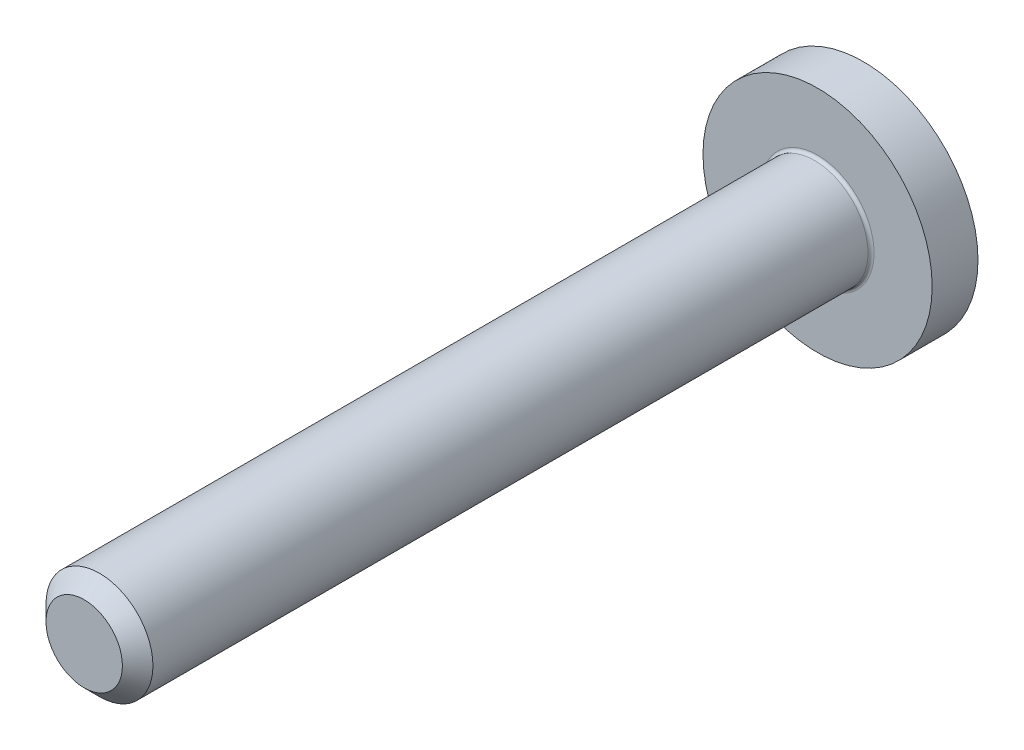
ISO-10303-21;
HEADER;
FILE_DESCRIPTION(('STEP AP214'),'2;1');
FILE_NAME('part.step','',(''),(''),'','','');
FILE_SCHEMA(('AUTOMOTIVE_DESIGN { 1 0 10303 214 1 1 1 1 }'));
ENDSEC;
DATA;
#1=APPLICATION_CONTEXT('core data for automotive mechanical design processes');
#2=APPLICATION_PROTOCOL_DEFINITION('international standard','automotive_design',2000,#1);
#3=PRODUCT_CONTEXT('',#1,'mechanical');
#4=PRODUCT('Part','Part','',(#3));
#5=PRODUCT_RELATED_PRODUCT_CATEGORY('part','',(#4));
#6=PRODUCT_DEFINITION_FORMATION('','',#4);
#7=PRODUCT_DEFINITION_CONTEXT('part definition',#1,'design');
#8=PRODUCT_DEFINITION('design','',#6,#7);
#9=PRODUCT_DEFINITION_SHAPE('','',#8);
#10=(LENGTH_UNIT() NAMED_UNIT(*) SI_UNIT(.MILLI.,.METRE.));
#11=(NAMED_UNIT(*) PLANE_ANGLE_UNIT() SI_UNIT($,.RADIAN.));
#12=(NAMED_UNIT(*) SI_UNIT($,.STERADIAN.) SOLID_ANGLE_UNIT());
#13=UNCERTAINTY_MEASURE_WITH_UNIT(LENGTH_MEASURE(1.E-05),#10,'distance_accuracy_value','');
#14=(GEOMETRIC_REPRESENTATION_CONTEXT(3) GLOBAL_UNCERTAINTY_ASSIGNED_CONTEXT((#13)) GLOBAL_UNIT_ASSIGNED_CONTEXT((#10,
#11,#12)) REPRESENTATION_CONTEXT('',''));
#15=CARTESIAN_POINT('',(0.,0.,0.));
#16=DIRECTION('',(0.,0.,1.));
#17=DIRECTION('',(1.,0.,0.));
#18=AXIS2_PLACEMENT_3D('',#15,#16,#17);
#19=CARTESIAN_POINT('',(0.,0.,48.));
#20=DIRECTION('',(0.,0.,-1.));
#21=DIRECTION('',(-1.,0.,0.));
#22=AXIS2_PLACEMENT_3D('',#19,#20,#21);
#23=CYLINDRICAL_SURFACE('',#22,3.5);
#24=CARTESIAN_POINT('',(0.,0.,0.199999999999999));
#25=DIRECTION('',(0.,0.,-1.));
#26=DIRECTION('',(-1.,0.,0.));
#27=AXIS2_PLACEMENT_3D('',#24,#25,#26);
#28=CIRCLE('',#27,3.5);
#29=CARTESIAN_POINT('',(-3.5,0.,0.199999999999999));
#30=VERTEX_POINT('',#29);
#31=EDGE_CURVE('E47',#30,#30,#28,.F.);
#32=ORIENTED_EDGE('',*,*,#31,.T.);
#33=EDGE_LOOP('',(#32));
#34=FACE_BOUND('',#33,.T.);
#35=CARTESIAN_POINT('',(0.,0.,47.));
#36=DIRECTION('',(0.,0.,1.));
#37=DIRECTION('',(1.,0.,0.));
#38=AXIS2_PLACEMENT_3D('',#35,#36,#37);
#39=CIRCLE('',#38,3.5);
#40=CARTESIAN_POINT('',(3.5,0.,47.));
#41=VERTEX_POINT('',#40);
#42=EDGE_CURVE('E52',#41,#41,#39,.F.);
#43=ORIENTED_EDGE('',*,*,#42,.T.);
#44=EDGE_LOOP('',(#43));
#45=FACE_BOUND('',#44,.T.);
#46=ADVANCED_FACE('F39',(#34,#45),#23,.T.);
#47=CARTESIAN_POINT('',(0.,0.,48.));
#48=DIRECTION('',(0.,0.,1.));
#49=DIRECTION('',(1.,0.,0.));
#50=AXIS2_PLACEMENT_3D('',#47,#48,#49);
#51=PLANE('',#50);
#52=CARTESIAN_POINT('',(0.,0.,48.));
#53=DIRECTION('',(0.,0.,1.));
#54=DIRECTION('',(1.,0.,0.));
#55=AXIS2_PLACEMENT_3D('',#52,#53,#54);
#56=CIRCLE('',#55,2.5);
#57=CARTESIAN_POINT('',(2.5,0.,48.));
#58=VERTEX_POINT('',#57);
#59=EDGE_CURVE('E57',#58,#58,#56,.T.);
#60=ORIENTED_EDGE('',*,*,#59,.T.);
#61=EDGE_LOOP('',(#60));
#62=FACE_BOUND('',#61,.T.);
#63=ADVANCED_FACE('F77',(#62),#51,.T.);
#64=CARTESIAN_POINT('',(0.,0.,-3.));
#65=DIRECTION('',(0.,0.,1.));
#66=DIRECTION('',(1.,0.,0.));
#67=AXIS2_PLACEMENT_3D('',#64,#65,#66);
#68=CYLINDRICAL_SURFACE('',#67,7.5);
#69=CARTESIAN_POINT('',(0.,0.,-3.));
#70=DIRECTION('',(0.,0.,-1.));
#71=DIRECTION('',(-1.,0.,0.));
#72=AXIS2_PLACEMENT_3D('',#69,#70,#71);
#73=CIRCLE('',#72,7.5);
#74=CARTESIAN_POINT('',(-7.5,0.,-3.));
#75=VERTEX_POINT('',#74);
#76=EDGE_CURVE('E63',#75,#75,#73,.T.);
#77=ORIENTED_EDGE('',*,*,#76,.F.);
#78=EDGE_LOOP('',(#77));
#79=FACE_BOUND('',#78,.T.);
#80=CARTESIAN_POINT('',(0.,0.,0.));
#81=DIRECTION('',(0.,0.,-1.));
#82=DIRECTION('',(-1.,0.,0.));
#83=AXIS2_PLACEMENT_3D('',#80,#81,#82);
#84=CIRCLE('',#83,7.5);
#85=CARTESIAN_POINT('',(-7.5,0.,0.));
#86=VERTEX_POINT('',#85);
#87=EDGE_CURVE('E64',#86,#86,#84,.T.);
#88=ORIENTED_EDGE('',*,*,#87,.T.);
#89=EDGE_LOOP('',(#88));
#90=FACE_BOUND('',#89,.T.);
#91=ADVANCED_FACE('F74',(#79,#90),#68,.T.);
#92=CARTESIAN_POINT('',(0.,0.,-3.));
#93=DIRECTION('',(0.,0.,-1.));
#94=DIRECTION('',(-1.,0.,0.));
#95=AXIS2_PLACEMENT_3D('',#92,#93,#94);
#96=PLANE('',#95);
#97=ORIENTED_EDGE('',*,*,#76,.T.);
#98=EDGE_LOOP('',(#97));
#99=FACE_BOUND('',#98,.T.);
#100=ADVANCED_FACE('F72',(#99),#96,.T.);
#101=CARTESIAN_POINT('',(0.,0.,0.));
#102=DIRECTION('',(0.,0.,-1.));
#103=DIRECTION('',(-1.,0.,0.));
#104=AXIS2_PLACEMENT_3D('',#101,#102,#103);
#105=PLANE('',#104);
#106=CARTESIAN_POINT('',(0.,0.,0.));
#107=DIRECTION('',(0.,0.,-1.));
#108=DIRECTION('',(-1.,0.,0.));
#109=AXIS2_PLACEMENT_3D('',#106,#107,#108);
#110=CIRCLE('',#109,3.7);
#111=CARTESIAN_POINT('',(-3.7,0.,0.));
#112=VERTEX_POINT('',#111);
#113=EDGE_CURVE('E10',#112,#112,#110,.T.);
#114=ORIENTED_EDGE('',*,*,#113,.T.);
#115=EDGE_LOOP('',(#114));
#116=FACE_BOUND('',#115,.T.);
#117=ORIENTED_EDGE('',*,*,#87,.F.);
#118=EDGE_LOOP('',(#117));
#119=FACE_BOUND('',#118,.T.);
#120=ADVANCED_FACE('F81',(#116,#119),#105,.F.);
#121=CARTESIAN_POINT('',(0.,0.,48.));
#122=DIRECTION('',(0.,0.,-1.));
#123=DIRECTION('',(-1.,0.,0.));
#124=AXIS2_PLACEMENT_3D('',#121,#122,#123);
#125=CONICAL_SURFACE('',#124,2.5,0.78539816339745);
#126=ORIENTED_EDGE('',*,*,#42,.F.);
#127=EDGE_LOOP('',(#126));
#128=FACE_BOUND('',#127,.T.);
#129=ORIENTED_EDGE('',*,*,#59,.F.);
#130=EDGE_LOOP('',(#129));
#131=FACE_BOUND('',#130,.T.);
#132=ADVANCED_FACE('F83',(#128,#131),#125,.T.);
#133=CARTESIAN_POINT('',(0.,0.,0.199999999999999));
#134=DIRECTION('',(0.,0.,-1.));
#135=DIRECTION('',(-1.,0.,0.));
#136=AXIS2_PLACEMENT_3D('',#133,#134,#135);
#137=TOROIDAL_SURFACE('',#136,3.7,0.2);
#138=ORIENTED_EDGE('',*,*,#113,.F.);
#139=EDGE_LOOP('',(#138));
#140=FACE_BOUND('',#139,.T.);
#141=ORIENTED_EDGE('',*,*,#31,.F.);
#142=EDGE_LOOP('',(#141));
#143=FACE_BOUND('',#142,.T.);
#144=ADVANCED_FACE('F41',(#140,#143),#137,.F.);
#145=CLOSED_SHELL('',(#46,#63,#91,#100,#120,#132,#144));
#146=MANIFOLD_SOLID_BREP('B2',#145);
#147=ADVANCED_BREP_SHAPE_REPRESENTATION('',(#18,#146),#14);
#148=SHAPE_DEFINITION_REPRESENTATION(#9,#147);
ENDSEC;
END-ISO-10303-21;
